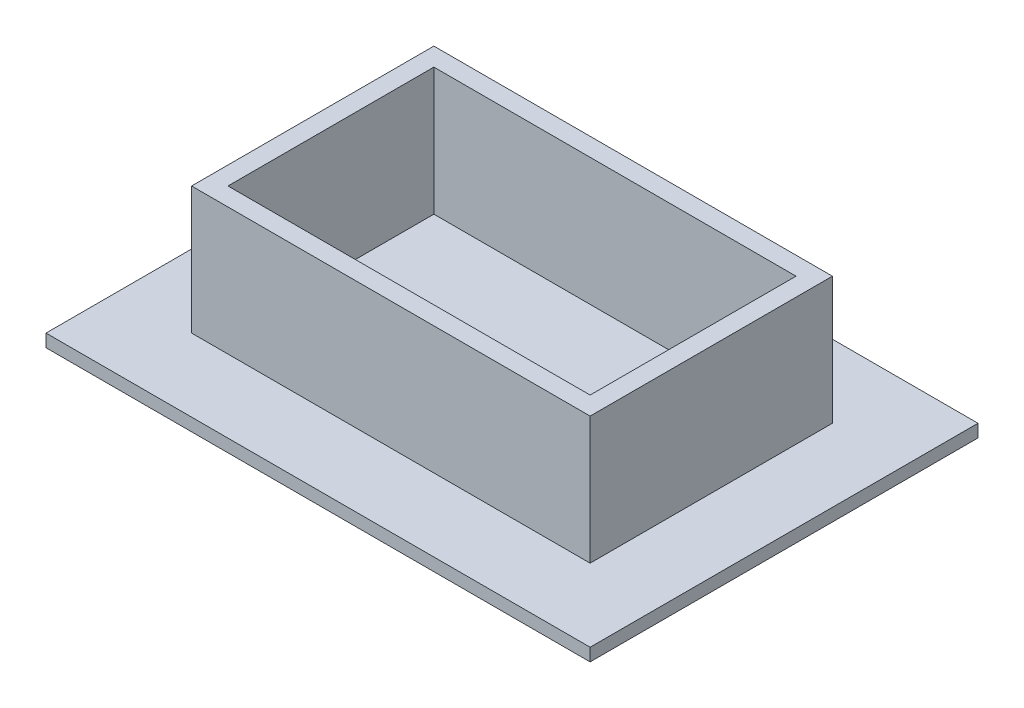
ISO-10303-21;
HEADER;
FILE_DESCRIPTION(('STEP AP214'),'2;1');
FILE_NAME('part.step','',(''),(''),'','','');
FILE_SCHEMA(('AUTOMOTIVE_DESIGN { 1 0 10303 214 1 1 1 1 }'));
ENDSEC;
DATA;
#1=APPLICATION_CONTEXT('core data for automotive mechanical design processes');
#2=APPLICATION_PROTOCOL_DEFINITION('international standard','automotive_design',2000,#1);
#3=PRODUCT_CONTEXT('',#1,'mechanical');
#4=PRODUCT('Part','Part','',(#3));
#5=PRODUCT_RELATED_PRODUCT_CATEGORY('part','',(#4));
#6=PRODUCT_DEFINITION_FORMATION('','',#4);
#7=PRODUCT_DEFINITION_CONTEXT('part definition',#1,'design');
#8=PRODUCT_DEFINITION('design','',#6,#7);
#9=PRODUCT_DEFINITION_SHAPE('','',#8);
#10=(LENGTH_UNIT() NAMED_UNIT(*) SI_UNIT(.MILLI.,.METRE.));
#11=(NAMED_UNIT(*) PLANE_ANGLE_UNIT() SI_UNIT($,.RADIAN.));
#12=(NAMED_UNIT(*) SI_UNIT($,.STERADIAN.) SOLID_ANGLE_UNIT());
#13=UNCERTAINTY_MEASURE_WITH_UNIT(LENGTH_MEASURE(1.E-05),#10,'distance_accuracy_value','');
#14=(GEOMETRIC_REPRESENTATION_CONTEXT(3) GLOBAL_UNCERTAINTY_ASSIGNED_CONTEXT((#13)) GLOBAL_UNIT_ASSIGNED_CONTEXT((#10,
#11,#12)) REPRESENTATION_CONTEXT('',''));
#15=CARTESIAN_POINT('',(0.,0.,0.));
#16=DIRECTION('',(0.,0.,1.));
#17=DIRECTION('',(1.,0.,0.));
#18=AXIS2_PLACEMENT_3D('',#15,#16,#17);
#19=CARTESIAN_POINT('',(37.9738005181294,1.778,-27.0703684749232));
#20=DIRECTION('',(-1.,0.,0.));
#21=DIRECTION('',(0.,0.,1.));
#22=AXIS2_PLACEMENT_3D('',#19,#20,#21);
#23=PLANE('',#22);
#24=DIRECTION('',(0.,0.,-1.));
#25=VECTOR('',#24,1.);
#26=CARTESIAN_POINT('',(37.9738005181294,0.,-27.0703684749232));
#27=LINE('',#26,#25);
#28=CARTESIAN_POINT('',(37.9738005181294,0.,27.0703684749232));
#29=VERTEX_POINT('',#28);
#30=CARTESIAN_POINT('',(37.9738005181294,0.,-27.0703684749232));
#31=VERTEX_POINT('',#30);
#32=EDGE_CURVE('E243',#29,#31,#27,.T.);
#33=ORIENTED_EDGE('',*,*,#32,.T.);
#34=DIRECTION('',(0.,-1.,0.));
#35=VECTOR('',#34,1.);
#36=CARTESIAN_POINT('',(37.9738005181294,1.778,-27.0703684749232));
#37=LINE('',#36,#35);
#38=CARTESIAN_POINT('',(37.9738005181294,1.778,-27.0703684749232));
#39=VERTEX_POINT('',#38);
#40=EDGE_CURVE('E12',#39,#31,#37,.T.);
#41=ORIENTED_EDGE('',*,*,#40,.F.);
#42=DIRECTION('',(0.,0.,-1.));
#43=VECTOR('',#42,1.);
#44=CARTESIAN_POINT('',(37.9738005181294,1.778,-27.0703684749232));
#45=LINE('',#44,#43);
#46=CARTESIAN_POINT('',(37.9738005181294,1.778,27.0703684749232));
#47=VERTEX_POINT('',#46);
#48=EDGE_CURVE('E251',#47,#39,#45,.T.);
#49=ORIENTED_EDGE('',*,*,#48,.F.);
#50=DIRECTION('',(0.,-1.,0.));
#51=VECTOR('',#50,1.);
#52=CARTESIAN_POINT('',(37.9738005181294,1.778,27.0703684749232));
#53=LINE('',#52,#51);
#54=EDGE_CURVE('E265',#47,#29,#53,.T.);
#55=ORIENTED_EDGE('',*,*,#54,.T.);
#56=EDGE_LOOP('',(#33,#41,#49,#55));
#57=FACE_BOUND('',#56,.T.);
#58=ADVANCED_FACE('F67',(#57),#23,.F.);
#59=CARTESIAN_POINT('',(-37.9738005181294,1.778,-27.0703684749232));
#60=DIRECTION('',(0.,0.,1.));
#61=DIRECTION('',(1.,0.,0.));
#62=AXIS2_PLACEMENT_3D('',#59,#60,#61);
#63=PLANE('',#62);
#64=DIRECTION('',(-1.,0.,0.));
#65=VECTOR('',#64,1.);
#66=CARTESIAN_POINT('',(-37.9738005181294,0.,-27.0703684749232));
#67=LINE('',#66,#65);
#68=CARTESIAN_POINT('',(-37.9738005181294,0.,-27.0703684749232));
#69=VERTEX_POINT('',#68);
#70=EDGE_CURVE('E269',#31,#69,#67,.T.);
#71=ORIENTED_EDGE('',*,*,#70,.T.);
#72=DIRECTION('',(0.,-1.,0.));
#73=VECTOR('',#72,1.);
#74=CARTESIAN_POINT('',(-37.9738005181294,1.778,-27.0703684749232));
#75=LINE('',#74,#73);
#76=CARTESIAN_POINT('',(-37.9738005181294,1.778,-27.0703684749232));
#77=VERTEX_POINT('',#76);
#78=EDGE_CURVE('E75',#77,#69,#75,.T.);
#79=ORIENTED_EDGE('',*,*,#78,.F.);
#80=DIRECTION('',(-1.,0.,0.));
#81=VECTOR('',#80,1.);
#82=CARTESIAN_POINT('',(-37.9738005181294,1.778,-27.0703684749232));
#83=LINE('',#82,#81);
#84=EDGE_CURVE('E255',#39,#77,#83,.T.);
#85=ORIENTED_EDGE('',*,*,#84,.F.);
#86=ORIENTED_EDGE('',*,*,#40,.T.);
#87=EDGE_LOOP('',(#71,#79,#85,#86));
#88=FACE_BOUND('',#87,.T.);
#89=ADVANCED_FACE('F305',(#88),#63,.F.);
#90=CARTESIAN_POINT('',(-37.9738005181294,1.778,-27.0703684749232));
#91=DIRECTION('',(1.,0.,0.));
#92=DIRECTION('',(0.,0.,-1.));
#93=AXIS2_PLACEMENT_3D('',#90,#91,#92);
#94=PLANE('',#93);
#95=DIRECTION('',(0.,0.,1.));
#96=VECTOR('',#95,1.);
#97=CARTESIAN_POINT('',(-37.9738005181294,0.,-27.0703684749232));
#98=LINE('',#97,#96);
#99=CARTESIAN_POINT('',(-37.9738005181294,0.,27.0703684749232));
#100=VERTEX_POINT('',#99);
#101=EDGE_CURVE('E272',#69,#100,#98,.T.);
#102=ORIENTED_EDGE('',*,*,#101,.T.);
#103=DIRECTION('',(0.,-1.,0.));
#104=VECTOR('',#103,1.);
#105=CARTESIAN_POINT('',(-37.9738005181294,1.778,27.0703684749232));
#106=LINE('',#105,#104);
#107=CARTESIAN_POINT('',(-37.9738005181294,1.778,27.0703684749232));
#108=VERTEX_POINT('',#107);
#109=EDGE_CURVE('E280',#108,#100,#106,.T.);
#110=ORIENTED_EDGE('',*,*,#109,.F.);
#111=DIRECTION('',(0.,0.,1.));
#112=VECTOR('',#111,1.);
#113=CARTESIAN_POINT('',(-37.9738005181294,1.778,-27.0703684749232));
#114=LINE('',#113,#112);
#115=EDGE_CURVE('E259',#77,#108,#114,.T.);
#116=ORIENTED_EDGE('',*,*,#115,.F.);
#117=ORIENTED_EDGE('',*,*,#78,.T.);
#118=EDGE_LOOP('',(#102,#110,#116,#117));
#119=FACE_BOUND('',#118,.T.);
#120=ADVANCED_FACE('F289',(#119),#94,.F.);
#121=CARTESIAN_POINT('',(-37.9738005181294,1.778,27.0703684749232));
#122=DIRECTION('',(0.,0.,-1.));
#123=DIRECTION('',(-1.,0.,0.));
#124=AXIS2_PLACEMENT_3D('',#121,#122,#123);
#125=PLANE('',#124);
#126=DIRECTION('',(1.,0.,0.));
#127=VECTOR('',#126,1.);
#128=CARTESIAN_POINT('',(-37.9738005181294,0.,27.0703684749232));
#129=LINE('',#128,#127);
#130=EDGE_CURVE('E256',#100,#29,#129,.T.);
#131=ORIENTED_EDGE('',*,*,#130,.T.);
#132=ORIENTED_EDGE('',*,*,#54,.F.);
#133=DIRECTION('',(1.,0.,0.));
#134=VECTOR('',#133,1.);
#135=CARTESIAN_POINT('',(-37.9738005181294,1.778,27.0703684749232));
#136=LINE('',#135,#134);
#137=EDGE_CURVE('E262',#108,#47,#136,.T.);
#138=ORIENTED_EDGE('',*,*,#137,.F.);
#139=ORIENTED_EDGE('',*,*,#109,.T.);
#140=EDGE_LOOP('',(#131,#132,#138,#139));
#141=FACE_BOUND('',#140,.T.);
#142=ADVANCED_FACE('F298',(#141),#125,.F.);
#143=CARTESIAN_POINT('',(0.,1.778,0.));
#144=DIRECTION('',(0.,1.,0.));
#145=DIRECTION('',(0.,0.,1.));
#146=AXIS2_PLACEMENT_3D('',#143,#144,#145);
#147=PLANE('',#146);
#148=DIRECTION('',(1.,0.,0.));
#149=VECTOR('',#148,1.);
#150=CARTESIAN_POINT('',(-25.2738005181294,1.778,-16.9103684749232));
#151=LINE('',#150,#149);
#152=CARTESIAN_POINT('',(-27.8138005181294,1.778,-16.9103684749232));
#153=VERTEX_POINT('',#152);
#154=CARTESIAN_POINT('',(27.8138005181294,1.778,-16.9103684749232));
#155=VERTEX_POINT('',#154);
#156=EDGE_CURVE('E205',#153,#155,#151,.T.);
#157=ORIENTED_EDGE('',*,*,#156,.T.);
#158=DIRECTION('',(0.,0.,-1.));
#159=VECTOR('',#158,1.);
#160=CARTESIAN_POINT('',(27.8138005181294,1.778,14.3703684749232));
#161=LINE('',#160,#159);
#162=CARTESIAN_POINT('',(27.8138005181294,1.778,16.9103684749232));
#163=VERTEX_POINT('',#162);
#164=EDGE_CURVE('E231',#163,#155,#161,.T.);
#165=ORIENTED_EDGE('',*,*,#164,.F.);
#166=DIRECTION('',(1.,0.,0.));
#167=VECTOR('',#166,1.);
#168=CARTESIAN_POINT('',(-25.2738005181294,1.778,16.9103684749232));
#169=LINE('',#168,#167);
#170=CARTESIAN_POINT('',(-27.8138005181294,1.778,16.9103684749232));
#171=VERTEX_POINT('',#170);
#172=EDGE_CURVE('E234',#171,#163,#169,.T.);
#173=ORIENTED_EDGE('',*,*,#172,.F.);
#174=DIRECTION('',(0.,0.,-1.));
#175=VECTOR('',#174,1.);
#176=CARTESIAN_POINT('',(-27.8138005181294,1.778,14.3703684749232));
#177=LINE('',#176,#175);
#178=EDGE_CURVE('E217',#171,#153,#177,.T.);
#179=ORIENTED_EDGE('',*,*,#178,.T.);
#180=EDGE_LOOP('',(#157,#165,#173,#179));
#181=FACE_BOUND('',#180,.T.);
#182=ORIENTED_EDGE('',*,*,#48,.T.);
#183=ORIENTED_EDGE('',*,*,#84,.T.);
#184=ORIENTED_EDGE('',*,*,#115,.T.);
#185=ORIENTED_EDGE('',*,*,#137,.T.);
#186=EDGE_LOOP('',(#182,#183,#184,#185));
#187=FACE_BOUND('',#186,.T.);
#188=ADVANCED_FACE('F304',(#181,#187),#147,.T.);
#189=CARTESIAN_POINT('',(0.,0.,0.));
#190=DIRECTION('',(0.,1.,0.));
#191=DIRECTION('',(0.,0.,1.));
#192=AXIS2_PLACEMENT_3D('',#189,#190,#191);
#193=PLANE('',#192);
#194=ORIENTED_EDGE('',*,*,#32,.F.);
#195=ORIENTED_EDGE('',*,*,#130,.F.);
#196=ORIENTED_EDGE('',*,*,#101,.F.);
#197=ORIENTED_EDGE('',*,*,#70,.F.);
#198=EDGE_LOOP('',(#194,#195,#196,#197));
#199=FACE_BOUND('',#198,.T.);
#200=ADVANCED_FACE('F295',(#199),#193,.F.);
#201=CARTESIAN_POINT('',(-25.2738005181294,19.558,-16.9103684749232));
#202=DIRECTION('',(0.,0.,-1.));
#203=DIRECTION('',(-1.,0.,0.));
#204=AXIS2_PLACEMENT_3D('',#201,#202,#203);
#205=PLANE('',#204);
#206=ORIENTED_EDGE('',*,*,#156,.F.);
#207=DIRECTION('',(0.,-1.,0.));
#208=VECTOR('',#207,1.);
#209=CARTESIAN_POINT('',(-27.8138005181294,19.558,-16.9103684749232));
#210=LINE('',#209,#208);
#211=CARTESIAN_POINT('',(-27.8138005181294,19.558,-16.9103684749232));
#212=VERTEX_POINT('',#211);
#213=EDGE_CURVE('E240',#212,#153,#210,.T.);
#214=ORIENTED_EDGE('',*,*,#213,.F.);
#215=DIRECTION('',(1.,0.,0.));
#216=VECTOR('',#215,1.);
#217=CARTESIAN_POINT('',(-25.2738005181294,19.558,-16.9103684749232));
#218=LINE('',#217,#216);
#219=CARTESIAN_POINT('',(27.8138005181294,19.558,-16.9103684749232));
#220=VERTEX_POINT('',#219);
#221=EDGE_CURVE('E212',#212,#220,#218,.T.);
#222=ORIENTED_EDGE('',*,*,#221,.T.);
#223=DIRECTION('',(0.,-1.,0.));
#224=VECTOR('',#223,1.);
#225=CARTESIAN_POINT('',(27.8138005181294,19.558,-16.9103684749232));
#226=LINE('',#225,#224);
#227=EDGE_CURVE('E227',#220,#155,#226,.T.);
#228=ORIENTED_EDGE('',*,*,#227,.T.);
#229=EDGE_LOOP('',(#206,#214,#222,#228));
#230=FACE_BOUND('',#229,.T.);
#231=ADVANCED_FACE('F317',(#230),#205,.T.);
#232=CARTESIAN_POINT('',(-27.8138005181294,19.558,14.3703684749232));
#233=DIRECTION('',(-1.,0.,0.));
#234=DIRECTION('',(0.,0.,1.));
#235=AXIS2_PLACEMENT_3D('',#232,#233,#234);
#236=PLANE('',#235);
#237=ORIENTED_EDGE('',*,*,#178,.F.);
#238=DIRECTION('',(0.,-1.,0.));
#239=VECTOR('',#238,1.);
#240=CARTESIAN_POINT('',(-27.8138005181294,19.558,16.9103684749232));
#241=LINE('',#240,#239);
#242=CARTESIAN_POINT('',(-27.8138005181294,19.558,16.9103684749232));
#243=VERTEX_POINT('',#242);
#244=EDGE_CURVE('E244',#243,#171,#241,.T.);
#245=ORIENTED_EDGE('',*,*,#244,.F.);
#246=DIRECTION('',(0.,0.,-1.));
#247=VECTOR('',#246,1.);
#248=CARTESIAN_POINT('',(-27.8138005181294,19.558,14.3703684749232));
#249=LINE('',#248,#247);
#250=EDGE_CURVE('E223',#243,#212,#249,.T.);
#251=ORIENTED_EDGE('',*,*,#250,.T.);
#252=ORIENTED_EDGE('',*,*,#213,.T.);
#253=EDGE_LOOP('',(#237,#245,#251,#252));
#254=FACE_BOUND('',#253,.T.);
#255=ADVANCED_FACE('F324',(#254),#236,.T.);
#256=CARTESIAN_POINT('',(-25.2738005181294,19.558,16.9103684749232));
#257=DIRECTION('',(0.,0.,-1.));
#258=DIRECTION('',(-1.,0.,0.));
#259=AXIS2_PLACEMENT_3D('',#256,#257,#258);
#260=PLANE('',#259);
#261=ORIENTED_EDGE('',*,*,#172,.T.);
#262=DIRECTION('',(0.,-1.,0.));
#263=VECTOR('',#262,1.);
#264=CARTESIAN_POINT('',(27.8138005181294,19.558,16.9103684749232));
#265=LINE('',#264,#263);
#266=CARTESIAN_POINT('',(27.8138005181294,19.558,16.9103684749232));
#267=VERTEX_POINT('',#266);
#268=EDGE_CURVE('E82',#267,#163,#265,.T.);
#269=ORIENTED_EDGE('',*,*,#268,.F.);
#270=DIRECTION('',(1.,0.,0.));
#271=VECTOR('',#270,1.);
#272=CARTESIAN_POINT('',(-25.2738005181294,19.558,16.9103684749232));
#273=LINE('',#272,#271);
#274=EDGE_CURVE('E220',#243,#267,#273,.T.);
#275=ORIENTED_EDGE('',*,*,#274,.F.);
#276=ORIENTED_EDGE('',*,*,#244,.T.);
#277=EDGE_LOOP('',(#261,#269,#275,#276));
#278=FACE_BOUND('',#277,.T.);
#279=ADVANCED_FACE('F329',(#278),#260,.F.);
#280=CARTESIAN_POINT('',(27.8138005181294,19.558,14.3703684749232));
#281=DIRECTION('',(-1.,0.,0.));
#282=DIRECTION('',(0.,0.,1.));
#283=AXIS2_PLACEMENT_3D('',#280,#281,#282);
#284=PLANE('',#283);
#285=ORIENTED_EDGE('',*,*,#164,.T.);
#286=ORIENTED_EDGE('',*,*,#227,.F.);
#287=DIRECTION('',(0.,0.,-1.));
#288=VECTOR('',#287,1.);
#289=CARTESIAN_POINT('',(27.8138005181294,19.558,14.3703684749232));
#290=LINE('',#289,#288);
#291=EDGE_CURVE('E216',#267,#220,#290,.T.);
#292=ORIENTED_EDGE('',*,*,#291,.F.);
#293=ORIENTED_EDGE('',*,*,#268,.T.);
#294=EDGE_LOOP('',(#285,#286,#292,#293));
#295=FACE_BOUND('',#294,.T.);
#296=ADVANCED_FACE('F326',(#295),#284,.F.);
#297=CARTESIAN_POINT('',(0.,19.558,0.));
#298=DIRECTION('',(0.,1.,0.));
#299=DIRECTION('',(0.,0.,1.));
#300=AXIS2_PLACEMENT_3D('',#297,#298,#299);
#301=PLANE('',#300);
#302=DIRECTION('',(1.,0.,0.));
#303=VECTOR('',#302,1.);
#304=CARTESIAN_POINT('',(-25.2738005181294,19.558,-14.3703684749232));
#305=LINE('',#304,#303);
#306=CARTESIAN_POINT('',(-25.2738005181294,19.558,-14.3703684749232));
#307=VERTEX_POINT('',#306);
#308=CARTESIAN_POINT('',(25.2738005181294,19.558,-14.3703684749232));
#309=VERTEX_POINT('',#308);
#310=EDGE_CURVE('E171',#307,#309,#305,.T.);
#311=ORIENTED_EDGE('',*,*,#310,.T.);
#312=DIRECTION('',(0.,0.,-1.));
#313=VECTOR('',#312,1.);
#314=CARTESIAN_POINT('',(25.2738005181294,19.558,14.3703684749232));
#315=LINE('',#314,#313);
#316=CARTESIAN_POINT('',(25.2738005181294,19.558,14.3703684749232));
#317=VERTEX_POINT('',#316);
#318=EDGE_CURVE('E158',#317,#309,#315,.T.);
#319=ORIENTED_EDGE('',*,*,#318,.F.);
#320=DIRECTION('',(1.,0.,0.));
#321=VECTOR('',#320,1.);
#322=CARTESIAN_POINT('',(-25.2738005181294,19.558,14.3703684749232));
#323=LINE('',#322,#321);
#324=CARTESIAN_POINT('',(-25.2738005181294,19.558,14.3703684749232));
#325=VERTEX_POINT('',#324);
#326=EDGE_CURVE('E170',#325,#317,#323,.T.);
#327=ORIENTED_EDGE('',*,*,#326,.F.);
#328=DIRECTION('',(0.,0.,-1.));
#329=VECTOR('',#328,1.);
#330=CARTESIAN_POINT('',(-25.2738005181294,19.558,14.3703684749232));
#331=LINE('',#330,#329);
#332=EDGE_CURVE('E178',#325,#307,#331,.T.);
#333=ORIENTED_EDGE('',*,*,#332,.T.);
#334=EDGE_LOOP('',(#311,#319,#327,#333));
#335=FACE_BOUND('',#334,.T.);
#336=ORIENTED_EDGE('',*,*,#221,.F.);
#337=ORIENTED_EDGE('',*,*,#250,.F.);
#338=ORIENTED_EDGE('',*,*,#274,.T.);
#339=ORIENTED_EDGE('',*,*,#291,.T.);
#340=EDGE_LOOP('',(#336,#337,#338,#339));
#341=FACE_BOUND('',#340,.T.);
#342=ADVANCED_FACE('F180',(#335,#341),#301,.T.);
#343=CARTESIAN_POINT('',(-25.2738005181294,19.558,-14.3703684749232));
#344=DIRECTION('',(0.,0.,-1.));
#345=DIRECTION('',(-1.,0.,0.));
#346=AXIS2_PLACEMENT_3D('',#343,#344,#345);
#347=PLANE('',#346);
#348=DIRECTION('',(1.,0.,0.));
#349=VECTOR('',#348,1.);
#350=CARTESIAN_POINT('',(-25.2738005181294,1.778,-14.3703684749232));
#351=LINE('',#350,#349);
#352=CARTESIAN_POINT('',(-25.2738005181294,1.778,-14.3703684749232));
#353=VERTEX_POINT('',#352);
#354=CARTESIAN_POINT('',(25.2738005181294,1.778,-14.3703684749232));
#355=VERTEX_POINT('',#354);
#356=EDGE_CURVE('E90',#353,#355,#351,.T.);
#357=ORIENTED_EDGE('',*,*,#356,.T.);
#358=DIRECTION('',(0.,-1.,0.));
#359=VECTOR('',#358,1.);
#360=CARTESIAN_POINT('',(25.2738005181294,19.558,-14.3703684749232));
#361=LINE('',#360,#359);
#362=EDGE_CURVE('E162',#309,#355,#361,.T.);
#363=ORIENTED_EDGE('',*,*,#362,.F.);
#364=ORIENTED_EDGE('',*,*,#310,.F.);
#365=DIRECTION('',(0.,-1.,0.));
#366=VECTOR('',#365,1.);
#367=CARTESIAN_POINT('',(-25.2738005181294,19.558,-14.3703684749232));
#368=LINE('',#367,#366);
#369=EDGE_CURVE('E202',#307,#353,#368,.T.);
#370=ORIENTED_EDGE('',*,*,#369,.T.);
#371=EDGE_LOOP('',(#357,#363,#364,#370));
#372=FACE_BOUND('',#371,.T.);
#373=ADVANCED_FACE('F175',(#372),#347,.F.);
#374=CARTESIAN_POINT('',(-25.2738005181294,19.558,14.3703684749232));
#375=DIRECTION('',(-1.,0.,0.));
#376=DIRECTION('',(0.,0.,1.));
#377=AXIS2_PLACEMENT_3D('',#374,#375,#376);
#378=PLANE('',#377);
#379=DIRECTION('',(0.,0.,-1.));
#380=VECTOR('',#379,1.);
#381=CARTESIAN_POINT('',(-25.2738005181294,1.778,14.3703684749232));
#382=LINE('',#381,#380);
#383=CARTESIAN_POINT('',(-25.2738005181294,1.778,14.3703684749232));
#384=VERTEX_POINT('',#383);
#385=EDGE_CURVE('E184',#384,#353,#382,.T.);
#386=ORIENTED_EDGE('',*,*,#385,.T.);
#387=ORIENTED_EDGE('',*,*,#369,.F.);
#388=ORIENTED_EDGE('',*,*,#332,.F.);
#389=DIRECTION('',(0.,-1.,0.));
#390=VECTOR('',#389,1.);
#391=CARTESIAN_POINT('',(-25.2738005181294,19.558,14.3703684749232));
#392=LINE('',#391,#390);
#393=EDGE_CURVE('E206',#325,#384,#392,.T.);
#394=ORIENTED_EDGE('',*,*,#393,.T.);
#395=EDGE_LOOP('',(#386,#387,#388,#394));
#396=FACE_BOUND('',#395,.T.);
#397=ADVANCED_FACE('F340',(#396),#378,.F.);
#398=CARTESIAN_POINT('',(-25.2738005181294,19.558,14.3703684749232));
#399=DIRECTION('',(0.,0.,-1.));
#400=DIRECTION('',(-1.,0.,0.));
#401=AXIS2_PLACEMENT_3D('',#398,#399,#400);
#402=PLANE('',#401);
#403=DIRECTION('',(1.,0.,0.));
#404=VECTOR('',#403,1.);
#405=CARTESIAN_POINT('',(-25.2738005181294,1.778,14.3703684749232));
#406=LINE('',#405,#404);
#407=CARTESIAN_POINT('',(25.2738005181294,1.778,14.3703684749232));
#408=VERTEX_POINT('',#407);
#409=EDGE_CURVE('E188',#384,#408,#406,.T.);
#410=ORIENTED_EDGE('',*,*,#409,.F.);
#411=ORIENTED_EDGE('',*,*,#393,.F.);
#412=ORIENTED_EDGE('',*,*,#326,.T.);
#413=DIRECTION('',(0.,-1.,0.));
#414=VECTOR('',#413,1.);
#415=CARTESIAN_POINT('',(25.2738005181294,19.558,14.3703684749232));
#416=LINE('',#415,#414);
#417=EDGE_CURVE('E164',#317,#408,#416,.T.);
#418=ORIENTED_EDGE('',*,*,#417,.T.);
#419=EDGE_LOOP('',(#410,#411,#412,#418));
#420=FACE_BOUND('',#419,.T.);
#421=ADVANCED_FACE('F343',(#420),#402,.T.);
#422=CARTESIAN_POINT('',(25.2738005181294,19.558,14.3703684749232));
#423=DIRECTION('',(-1.,0.,0.));
#424=DIRECTION('',(0.,0.,1.));
#425=AXIS2_PLACEMENT_3D('',#422,#423,#424);
#426=PLANE('',#425);
#427=DIRECTION('',(0.,0.,-1.));
#428=VECTOR('',#427,1.);
#429=CARTESIAN_POINT('',(25.2738005181294,1.778,14.3703684749232));
#430=LINE('',#429,#428);
#431=EDGE_CURVE('E197',#408,#355,#430,.T.);
#432=ORIENTED_EDGE('',*,*,#431,.F.);
#433=ORIENTED_EDGE('',*,*,#417,.F.);
#434=ORIENTED_EDGE('',*,*,#318,.T.);
#435=ORIENTED_EDGE('',*,*,#362,.T.);
#436=EDGE_LOOP('',(#432,#433,#434,#435));
#437=FACE_BOUND('',#436,.T.);
#438=ADVANCED_FACE('F161',(#437),#426,.T.);
#439=ORIENTED_EDGE('',*,*,#431,.T.);
#440=ORIENTED_EDGE('',*,*,#356,.F.);
#441=ORIENTED_EDGE('',*,*,#385,.F.);
#442=ORIENTED_EDGE('',*,*,#409,.T.);
#443=EDGE_LOOP('',(#439,#440,#441,#442));
#444=FACE_BOUND('',#443,.T.);
#445=ADVANCED_FACE('F321',(#444),#147,.T.);
#446=CLOSED_SHELL('',(#58,#89,#120,#142,#188,#200,#231,#255,#279,#296,#342,#373,#397,#421,#438,#445));
#447=MANIFOLD_SOLID_BREP('B2',#446);
#448=ADVANCED_BREP_SHAPE_REPRESENTATION('',(#18,#447),#14);
#449=SHAPE_DEFINITION_REPRESENTATION(#9,#448);
ENDSEC;
END-ISO-10303-21;
